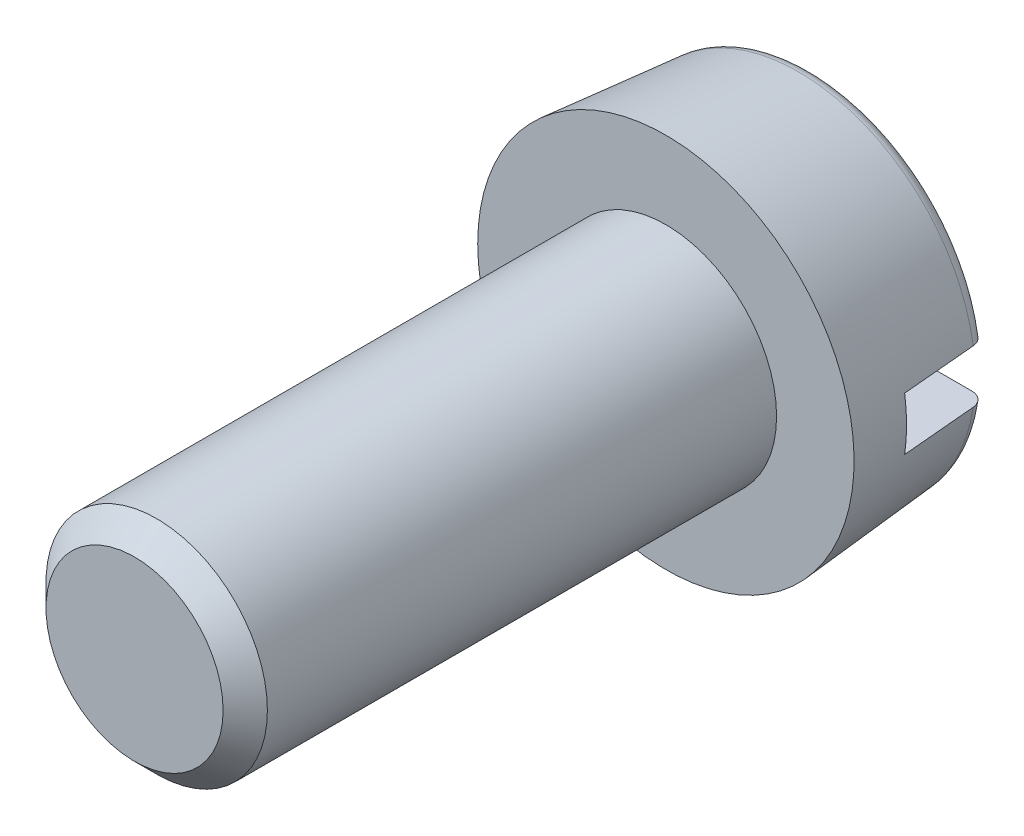
ISO-10303-21;
HEADER;
FILE_DESCRIPTION(('STEP AP214'),'2;1');
FILE_NAME('part.step','',(''),(''),'','','');
FILE_SCHEMA(('AUTOMOTIVE_DESIGN { 1 0 10303 214 1 1 1 1 }'));
ENDSEC;
DATA;
#1=APPLICATION_CONTEXT('core data for automotive mechanical design processes');
#2=APPLICATION_PROTOCOL_DEFINITION('international standard','automotive_design',2000,#1);
#3=PRODUCT_CONTEXT('',#1,'mechanical');
#4=PRODUCT('Part','Part','',(#3));
#5=PRODUCT_RELATED_PRODUCT_CATEGORY('part','',(#4));
#6=PRODUCT_DEFINITION_FORMATION('','',#4);
#7=PRODUCT_DEFINITION_CONTEXT('part definition',#1,'design');
#8=PRODUCT_DEFINITION('design','',#6,#7);
#9=PRODUCT_DEFINITION_SHAPE('','',#8);
#10=(LENGTH_UNIT() NAMED_UNIT(*) SI_UNIT(.MILLI.,.METRE.));
#11=(NAMED_UNIT(*) PLANE_ANGLE_UNIT() SI_UNIT($,.RADIAN.));
#12=(NAMED_UNIT(*) SI_UNIT($,.STERADIAN.) SOLID_ANGLE_UNIT());
#13=UNCERTAINTY_MEASURE_WITH_UNIT(LENGTH_MEASURE(1.E-05),#10,'distance_accuracy_value','');
#14=(GEOMETRIC_REPRESENTATION_CONTEXT(3) GLOBAL_UNCERTAINTY_ASSIGNED_CONTEXT((#13)) GLOBAL_UNIT_ASSIGNED_CONTEXT((#10,
#11,#12)) REPRESENTATION_CONTEXT('',''));
#15=CARTESIAN_POINT('',(0.,0.,0.));
#16=DIRECTION('',(0.,0.,1.));
#17=DIRECTION('',(1.,0.,0.));
#18=AXIS2_PLACEMENT_3D('',#15,#16,#17);
#19=CARTESIAN_POINT('',(0.,0.,-3.3));
#20=DIRECTION('',(0.,0.,1.));
#21=DIRECTION('',(1.,0.,0.));
#22=AXIS2_PLACEMENT_3D('',#19,#20,#21);
#23=PLANE('',#22);
#24=DIRECTION('',(1.,0.,0.));
#25=VECTOR('',#24,1.);
#26=CARTESIAN_POINT('',(-4.25,-0.6,-3.3));
#27=LINE('',#26,#25);
#28=CARTESIAN_POINT('',(-3.60936773882135,-0.6,-3.3));
#29=VERTEX_POINT('',#28);
#30=CARTESIAN_POINT('',(3.60936773882135,-0.6,-3.3));
#31=VERTEX_POINT('',#30);
#32=EDGE_CURVE('E190',#29,#31,#27,.T.);
#33=ORIENTED_EDGE('',*,*,#32,.T.);
#34=CARTESIAN_POINT('',(0.,0.,-3.3));
#35=DIRECTION('',(0.,0.,-1.));
#36=DIRECTION('',(-1.,0.,0.));
#37=AXIS2_PLACEMENT_3D('',#34,#35,#36);
#38=CIRCLE('',#37,3.6588981229387);
#39=EDGE_CURVE('E116',#31,#29,#38,.T.);
#40=ORIENTED_EDGE('',*,*,#39,.T.);
#41=EDGE_LOOP('',(#33,#40));
#42=FACE_BOUND('',#41,.T.);
#43=ADVANCED_FACE('F36',(#42),#23,.F.);
#44=DIRECTION('',(-1.,0.,0.));
#45=VECTOR('',#44,1.);
#46=CARTESIAN_POINT('',(-4.25,0.6,-3.3));
#47=LINE('',#46,#45);
#48=CARTESIAN_POINT('',(3.60936773882135,0.6,-3.3));
#49=VERTEX_POINT('',#48);
#50=CARTESIAN_POINT('',(-3.60936773882135,0.6,-3.3));
#51=VERTEX_POINT('',#50);
#52=EDGE_CURVE('E101',#49,#51,#47,.T.);
#53=ORIENTED_EDGE('',*,*,#52,.T.);
#54=EDGE_CURVE('E113',#51,#49,#38,.T.);
#55=ORIENTED_EDGE('',*,*,#54,.T.);
#56=EDGE_LOOP('',(#53,#55));
#57=FACE_BOUND('',#56,.T.);
#58=ADVANCED_FACE('F184',(#57),#23,.F.);
#59=CARTESIAN_POINT('',(0.,0.,-2.97));
#60=DIRECTION('',(0.,0.,-1.));
#61=DIRECTION('',(-1.,0.,0.));
#62=AXIS2_PLACEMENT_3D('',#59,#60,#61);
#63=TOROIDAL_SURFACE('',#62,3.6588981229387,0.330000000000001);
#64=CARTESIAN_POINT('',(-3.88093121590333,-0.6,-3.16235651870229));
#65=CARTESIAN_POINT('',(-3.89174650430115,-0.6,-3.14745596543585));
#66=CARTESIAN_POINT('',(-3.90131895220058,-0.6,-3.13163782999302));
#67=CARTESIAN_POINT('',(-3.91768386388027,-0.6,-3.09860811426153));
#68=CARTESIAN_POINT('',(-3.92447332099475,-0.6,-3.08139505084313));
#69=CARTESIAN_POINT('',(-3.93505791012376,-0.6,-3.04607287048011));
#70=CARTESIAN_POINT('',(-3.93885357012141,-0.6,-3.02796391213358));
#71=CARTESIAN_POINT('',(-3.94333535109313,-0.6,-2.99136961244277));
#72=CARTESIAN_POINT('',(-3.94402220053428,-0.6,-2.97288436029284));
#73=CARTESIAN_POINT('',(-3.94227140944713,-0.6,-2.9361368868103));
#74=CARTESIAN_POINT('',(-3.93984626629599,-0.6,-2.91787406886792));
#75=CARTESIAN_POINT('',(-3.93196602602826,-0.6,-2.88201412670734));
#76=CARTESIAN_POINT('',(-3.92651084758586,-0.6,-2.86441702037031));
#77=CARTESIAN_POINT('',(-3.91272898214808,-0.6,-2.83037210992902));
#78=CARTESIAN_POINT('',(-3.90440030256529,-0.6,-2.81392511289455));
#79=CARTESIAN_POINT('',(-3.88511861466897,-0.6,-2.78264968687381));
#80=CARTESIAN_POINT('',(-3.87416553729813,-0.6,-2.76782130049394));
#81=CARTESIAN_POINT('',(-3.84986660189993,-0.6,-2.74008712510161));
#82=CARTESIAN_POINT('',(-3.83650421986518,-0.6,-2.7271958174107));
#83=CARTESIAN_POINT('',(-3.80782590033311,-0.6,-2.70380952789554));
#84=CARTESIAN_POINT('',(-3.79250985946234,-0.6,-2.69331467295624));
#85=CARTESIAN_POINT('',(-3.76017561287824,-0.6,-2.67489241251668));
#86=CARTESIAN_POINT('',(-3.74314020192673,-0.6,-2.66699520734851));
#87=CARTESIAN_POINT('',(-3.70799548005462,-0.6,-2.65413616350433));
#88=CARTESIAN_POINT('',(-3.68988609932778,-0.6,-2.64917451586521));
#89=CARTESIAN_POINT('',(-3.65288598819943,-0.6,-2.64227180541858));
#90=CARTESIAN_POINT('',(-3.63398869431002,-0.6,-2.64036590382202));
#91=CARTESIAN_POINT('',(-3.59614043659641,-0.6,-2.63972980755772));
#92=CARTESIAN_POINT('',(-3.57718947014834,-0.6,-2.64099977092163));
#93=CARTESIAN_POINT('',(-3.53963364564484,-0.6,-2.64669886697945));
#94=CARTESIAN_POINT('',(-3.52103209259875,-0.6,-2.65114981293852));
#95=CARTESIAN_POINT('',(-3.48484117066273,-0.6,-2.66311534646283));
#96=CARTESIAN_POINT('',(-3.46725181166065,-0.6,-2.67062996395041));
#97=CARTESIAN_POINT('',(-3.43361753268664,-0.6,-2.68850884662317));
#98=CARTESIAN_POINT('',(-3.41757045287305,-0.6,-2.69886904591932));
#99=CARTESIAN_POINT('',(-3.38746679497394,-0.6,-2.72216302425203));
#100=CARTESIAN_POINT('',(-3.37341012214719,-0.6,-2.73509668072428));
#101=CARTESIAN_POINT('',(-3.34784979568404,-0.6,-2.76303096104915));
#102=CARTESIAN_POINT('',(-3.33632096945094,-0.6,-2.77800854314369));
#103=CARTESIAN_POINT('',(-3.31598781177585,-0.6,-2.80971149494498));
#104=CARTESIAN_POINT('',(-3.30718323692532,-0.6,-2.82643670832428));
#105=CARTESIAN_POINT('',(-3.29269082949409,-0.6,-2.86088519965016));
#106=CARTESIAN_POINT('',(-3.28695731461753,-0.6,-2.87858926166235));
#107=CARTESIAN_POINT('',(-3.27858571186085,-0.6,-2.91471449521117));
#108=CARTESIAN_POINT('',(-3.27594737138457,-0.6,-2.93313560810272));
#109=CARTESIAN_POINT('',(-3.27386359733721,-0.6,-2.96992922570346));
#110=CARTESIAN_POINT('',(-3.27437926370451,-0.6,-2.9882995379395));
#111=CARTESIAN_POINT('',(-3.27849603145179,-0.6,-3.02469054646185));
#112=CARTESIAN_POINT('',(-3.28209704814968,-0.6,-3.04271125232974));
#113=CARTESIAN_POINT('',(-3.29225896258976,-0.6,-3.0778495063858));
#114=CARTESIAN_POINT('',(-3.2988126837202,-0.6,-3.09496913265389));
#115=CARTESIAN_POINT('',(-3.31467711351297,-0.6,-3.12787861026696));
#116=CARTESIAN_POINT('',(-3.3239879156334,-0.6,-3.14366841651109));
#117=CARTESIAN_POINT('',(-3.34518159696389,-0.6,-3.17362232169774));
#118=CARTESIAN_POINT('',(-3.35708617614416,-0.6,-3.18777106006248));
#119=CARTESIAN_POINT('',(-3.38307011718918,-0.6,-3.21390575440203));
#120=CARTESIAN_POINT('',(-3.397149644745,-0.6,-3.22589154544908));
#121=CARTESIAN_POINT('',(-3.42730774319539,-0.6,-3.24754984447172));
#122=CARTESIAN_POINT('',(-3.44341295154226,-0.6,-3.25718526159405));
#123=CARTESIAN_POINT('',(-3.47699616958134,-0.6,-3.27365724363798));
#124=CARTESIAN_POINT('',(-3.49447428649553,-0.6,-3.28049358969709));
#125=CARTESIAN_POINT('',(-3.530559611778,-0.6,-3.29126249574783));
#126=CARTESIAN_POINT('',(-3.54917882328667,-0.6,-3.29515486284366));
#127=CARTESIAN_POINT('',(-3.58680532705641,-0.6,-3.29977905483034));
#128=CARTESIAN_POINT('',(-3.60581262161511,-0.6,-3.30051086100379));
#129=CARTESIAN_POINT('',(-3.64379387652628,-0.6,-3.29878612292724));
#130=CARTESIAN_POINT('',(-3.6627669953293,-0.6,-3.29631095100565));
#131=CARTESIAN_POINT('',(-3.70003092134979,-0.6,-3.2881993045486));
#132=CARTESIAN_POINT('',(-3.71832156288977,-0.6,-3.28256206765038));
#133=CARTESIAN_POINT('',(-3.75363601699996,-0.6,-3.26829463409941));
#134=CARTESIAN_POINT('',(-3.77066317119872,-0.6,-3.25967270079204));
#135=CARTESIAN_POINT('',(-3.80299261306495,-0.6,-3.23966998581314));
#136=CARTESIAN_POINT('',(-3.81829702760437,-0.6,-3.22829266186643));
#137=CARTESIAN_POINT('',(-3.84151948900552,-0.6,-3.20772421469506));
#138=CARTESIAN_POINT('',(-3.85009030219367,-0.6,-3.19925784921992));
#139=CARTESIAN_POINT('',(-3.86626148045935,-0.6,-3.18144383819673));
#140=CARTESIAN_POINT('',(-3.87386185148573,-0.6,-3.17209619805154));
#141=CARTESIAN_POINT('',(-3.88093121590333,-0.6,-3.16235651870229));
#142=B_SPLINE_CURVE_WITH_KNOTS('',3,(#64,#65,#66,#67,#68,#69,#70,#71,#72,#73,#74,#75,#76,#77,
#78,#79,#80,#81,#82,#83,#84,#85,#86,#87,#88,#89,#90,#91,#92,#93,#94,#95,#96,#97,#98,#99,#100,
#101,#102,#103,#104,#105,#106,#107,#108,#109,#110,#111,#112,#113,#114,#115,#116,#117,#118,#119,
#120,#121,#122,#123,#124,#125,#126,#127,#128,#129,#130,#131,#132,#133,#134,#135,#136,#137,#138,
#139,#140,#141),.UNSPECIFIED.,.T.,.F.,(4,2,2,2,2,2,2,2,2,2,2,2,2,2,2,2,2,2,2,2,2,2,2,2,2,2,2,2,
2,2,2,2,2,2,2,2,2,2,4),(0.,0.055192137510341,0.110443746898564,0.165685609987464,
0.220914527944668,0.275922345952343,0.330931640434962,0.38597915723318,0.441028122687705,
0.496470086974644,0.551914986065863,0.607983408306651,0.664055478903414,0.720768233421821,
0.777483810033931,0.834592086400185,0.891700920546502,0.948728575871203,1.00575351582767,
1.06218182397462,1.11860508886393,1.17416394419936,1.22971826507945,1.28458879784994,
1.3394578246644,1.39419420461358,1.44893244020039,1.50414752609964,1.55936682044904,
1.61540809585674,1.67145375235813,1.72825141241312,1.78504940883299,1.84217879901403,
1.89932196881453,1.95630818246031,2.0132232516225,2.04929956420957,2.08537565563636),.UNSPECIFIED.);
#143=CARTESIAN_POINT('',(-3.94224449995299,-0.6,-2.99876139510674));
#144=VERTEX_POINT('',#143);
#145=EDGE_CURVE('E58',#29,#144,#142,.T.);
#146=ORIENTED_EDGE('',*,*,#145,.F.);
#147=ORIENTED_EDGE('',*,*,#39,.F.);
#148=CARTESIAN_POINT('',(3.29440264116713,-0.6,-3.08230315486664));
#149=CARTESIAN_POINT('',(3.28809785682509,-0.6,-3.0651620918642));
#150=CARTESIAN_POINT('',(3.28322982249747,-0.6,-3.04747923181528));
#151=CARTESIAN_POINT('',(3.27652850861774,-0.6,-3.01153352646089));
#152=CARTESIAN_POINT('',(3.27469849047988,-0.6,-2.99327007927587));
#153=CARTESIAN_POINT('',(3.27413756897987,-0.6,-2.95670045280513));
#154=CARTESIAN_POINT('',(3.27540558007777,-0.6,-2.93839429073216));
#155=CARTESIAN_POINT('',(3.28099874541124,-0.6,-2.90226005994108));
#156=CARTESIAN_POINT('',(3.28532324094341,-0.6,-2.88443188907011));
#157=CARTESIAN_POINT('',(3.29689219553413,-0.6,-2.84975492468261));
#158=CARTESIAN_POINT('',(3.30413599281067,-0.6,-2.8329059101891));
#159=CARTESIAN_POINT('',(3.3213231213081,-0.6,-2.80064624787541));
#160=CARTESIAN_POINT('',(3.33126664812177,-0.6,-2.7852357043798));
#161=CARTESIAN_POINT('',(3.35366868808773,-0.6,-2.75612471593795));
#162=CARTESIAN_POINT('',(3.3661508913195,-0.6,-2.74244250841607));
#163=CARTESIAN_POINT('',(3.3932045000746,-0.6,-2.71732930698502));
#164=CARTESIAN_POINT('',(3.40777606367686,-0.6,-2.7058984835688));
#165=CARTESIAN_POINT('',(3.4388307483732,-0.6,-2.6854297211878));
#166=CARTESIAN_POINT('',(3.45533944088639,-0.6,-2.67643057577337));
#167=CARTESIAN_POINT('',(3.48961941011365,-0.6,-2.66129114238248));
#168=CARTESIAN_POINT('',(3.50739077810089,-0.6,-2.65515106131782));
#169=CARTESIAN_POINT('',(3.54393539998491,-0.6,-2.64582999278256));
#170=CARTESIAN_POINT('',(3.56271853642499,-0.6,-2.64268771745918));
#171=CARTESIAN_POINT('',(3.60054621208149,-0.6,-2.63958409837503));
#172=CARTESIAN_POINT('',(3.61959076161942,-0.6,-2.63962288057692));
#173=CARTESIAN_POINT('',(3.65749738812001,-0.6,-2.64289265374059));
#174=CARTESIAN_POINT('',(3.6763581390613,-0.6,-2.64613906556673));
#175=CARTESIAN_POINT('',(3.71326281795159,-0.6,-2.65576554493082));
#176=CARTESIAN_POINT('',(3.73130675511293,-0.6,-2.66214557711697));
#177=CARTESIAN_POINT('',(3.76597993786739,-0.6,-2.67783761718015));
#178=CARTESIAN_POINT('',(3.78261484226845,-0.6,-2.68713711450786));
#179=CARTESIAN_POINT('',(3.81406528030207,-0.6,-2.70842491997945));
#180=CARTESIAN_POINT('',(3.82888090706133,-0.6,-2.72041309040444));
#181=CARTESIAN_POINT('',(3.85610446338851,-0.6,-2.74660594588476));
#182=CARTESIAN_POINT('',(3.8685359407796,-0.6,-2.76078615300224));
#183=CARTESIAN_POINT('',(3.89080726868229,-0.6,-2.79105382298191));
#184=CARTESIAN_POINT('',(3.90064729259725,-0.6,-2.80714115812689));
#185=CARTESIAN_POINT('',(3.91733416350674,-0.6,-2.8405601028488));
#186=CARTESIAN_POINT('',(3.92421525385964,-0.6,-2.85787461681646));
#187=CARTESIAN_POINT('',(3.93494358812121,-0.6,-2.89341927857302));
#188=CARTESIAN_POINT('',(3.93879100056809,-0.6,-2.91164937543618));
#189=CARTESIAN_POINT('',(3.94331406953077,-0.6,-2.94833527146554));
#190=CARTESIAN_POINT('',(3.94401737622784,-0.6,-2.9667876662529));
#191=CARTESIAN_POINT('',(3.94230652264016,-0.6,-3.00354703268234));
#192=CARTESIAN_POINT('',(3.9398924431818,-0.6,-3.02185400808242));
#193=CARTESIAN_POINT('',(3.93203104319353,-0.6,-3.05775084711038));
#194=CARTESIAN_POINT('',(3.92659214557767,-0.6,-3.07534255713777));
#195=CARTESIAN_POINT('',(3.91284977874762,-0.6,-3.10936852204448));
#196=CARTESIAN_POINT('',(3.90454627778583,-0.6,-3.12580276409349));
#197=CARTESIAN_POINT('',(3.88528034162925,-0.6,-3.15712284793096));
#198=CARTESIAN_POINT('',(3.87430720464612,-0.6,-3.17200210415539));
#199=CARTESIAN_POINT('',(3.8500405242241,-0.6,-3.19972912529818));
#200=CARTESIAN_POINT('',(3.83674688385466,-0.6,-3.21257680531212));
#201=CARTESIAN_POINT('',(3.80808268454837,-0.6,-3.2360101962057));
#202=CARTESIAN_POINT('',(3.79269344022077,-0.6,-3.24657304653352));
#203=CARTESIAN_POINT('',(3.76037673698728,-0.6,-3.26500063670313));
#204=CARTESIAN_POINT('',(3.74344917997591,-0.6,-3.27286520430968));
#205=CARTESIAN_POINT('',(3.70832088101352,-0.6,-3.28577099453551));
#206=CARTESIAN_POINT('',(3.69010738623741,-0.6,-3.29077750898379));
#207=CARTESIAN_POINT('',(3.6531016000557,-0.6,-3.29769462174044));
#208=CARTESIAN_POINT('',(3.63430927286435,-0.6,-3.2996050282419));
#209=CARTESIAN_POINT('',(3.5964831986523,-0.6,-3.30028781473323));
#210=CARTESIAN_POINT('',(3.57744888872153,-0.6,-3.29902930399356));
#211=CARTESIAN_POINT('',(3.53985927541686,-0.6,-3.29334556711437));
#212=CARTESIAN_POINT('',(3.52130396970548,-0.6,-3.28892035643095));
#213=CARTESIAN_POINT('',(3.48514277386075,-0.6,-3.27700380858252));
#214=CARTESIAN_POINT('',(3.46753990766998,-0.6,-3.2695032879444));
#215=CARTESIAN_POINT('',(3.43384889483254,-0.6,-3.2516337097796));
#216=CARTESIAN_POINT('',(3.4177610975725,-0.6,-3.24126399275462));
#217=CARTESIAN_POINT('',(3.38766821281395,-0.6,-3.21800708615103));
#218=CARTESIAN_POINT('',(3.37365189483885,-0.6,-3.20513441907141));
#219=CARTESIAN_POINT('',(3.34803025055685,-0.6,-3.17719862775502));
#220=CARTESIAN_POINT('',(3.33642183903014,-0.6,-3.16213834909857));
#221=CARTESIAN_POINT('',(3.31975710330549,-0.6,-3.13617199806855));
#222=CARTESIAN_POINT('',(3.31386604176812,-0.6,-3.125791798727));
#223=CARTESIAN_POINT('',(3.30324676962177,-0.6,-3.10445241547406));
#224=CARTESIAN_POINT('',(3.29851854980378,-0.6,-3.09349323614869));
#225=CARTESIAN_POINT('',(3.29440264116713,-0.6,-3.08230315486664));
#226=B_SPLINE_CURVE_WITH_KNOTS('',3,(#148,#149,#150,#151,#152,#153,#154,#155,#156,#157,#158,
#159,#160,#161,#162,#163,#164,#165,#166,#167,#168,#169,#170,#171,#172,#173,#174,#175,#176,#177,
#178,#179,#180,#181,#182,#183,#184,#185,#186,#187,#188,#189,#190,#191,#192,#193,#194,#195,#196,
#197,#198,#199,#200,#201,#202,#203,#204,#205,#206,#207,#208,#209,#210,#211,#212,#213,#214,#215,
#216,#217,#218,#219,#220,#221,#222,#223,#224,#225),.UNSPECIFIED.,.T.,.F.,(4,2,2,2,2,2,2,2,2,2,2,
2,2,2,2,2,2,2,2,2,2,2,2,2,2,2,2,2,2,2,2,2,2,2,2,2,2,2,4),(0.,0.0547481625662647,
0.109555061239329,0.164342758497483,0.21911865205018,0.273882135331299,0.32864958723287,
0.383953717429165,0.439262034091064,0.495406610210971,0.551555248908528,0.608419522463505,
0.665286047715751,0.722427298874321,0.779567905411152,0.836466919420668,0.893363019621015,
0.949664412087646,1.00596203627061,1.06158935144854,1.11721357599228,1.17234765017797,
1.22748029489729,1.28246018032845,1.33744067510554,1.39264531122165,1.44785225386195,
1.50358833815955,1.55932797950943,1.61573086082995,1.67213723623064,1.72909558755459,
1.78605366087693,1.84318307540712,1.90032563232671,1.9571460332605,2.01389317499336,
2.04963432132589,2.08537518460094),.UNSPECIFIED.);
#227=CARTESIAN_POINT('',(3.94224449995295,-0.6,-2.99876139510673));
#228=VERTEX_POINT('',#227);
#229=EDGE_CURVE('E135',#228,#31,#226,.T.);
#230=ORIENTED_EDGE('',*,*,#229,.F.);
#231=CARTESIAN_POINT('',(0.,0.,-2.99876139510673));
#232=DIRECTION('',(0.,0.,-1.));
#233=DIRECTION('',(-1.,0.,0.));
#234=AXIS2_PLACEMENT_3D('',#231,#232,#233);
#235=CIRCLE('',#234,3.98764237330898);
#236=EDGE_CURVE('E125',#228,#144,#235,.T.);
#237=ORIENTED_EDGE('',*,*,#236,.T.);
#238=EDGE_LOOP('',(#146,#147,#230,#237));
#239=FACE_BOUND('',#238,.T.);
#240=ADVANCED_FACE('F140',(#239),#63,.T.);
#241=CARTESIAN_POINT('',(-3.88093121590333,0.6,-3.16235651870229));
#242=CARTESIAN_POINT('',(-3.86994562426118,0.6,-3.17748883766612));
#243=CARTESIAN_POINT('',(-3.8576617997997,0.6,-3.19169676662875));
#244=CARTESIAN_POINT('',(-3.83086570493505,0.6,-3.21785274484901));
#245=CARTESIAN_POINT('',(-3.81635047209743,0.6,-3.2297977420582));
#246=CARTESIAN_POINT('',(-3.78553913677772,0.6,-3.25107812608493));
#247=CARTESIAN_POINT('',(-3.76924481278604,0.6,-3.26041608642867));
#248=CARTESIAN_POINT('',(-3.73533536566413,0.6,-3.27624833155541));
#249=CARTESIAN_POINT('',(-3.71772056932636,0.6,-3.28274331721858));
#250=CARTESIAN_POINT('',(-3.68149968606228,0.6,-3.29277255152332));
#251=CARTESIAN_POINT('',(-3.66288621895556,0.6,-3.29628014823096));
#252=CARTESIAN_POINT('',(-3.62533412107233,0.6,-3.3001499555616));
#253=CARTESIAN_POINT('',(-3.60639545866776,0.6,-3.30051185848257));
#254=CARTESIAN_POINT('',(-3.56856016731013,0.6,-3.29807389596846));
#255=CARTESIAN_POINT('',(-3.54966526946925,0.6,-3.29524708144183));
#256=CARTESIAN_POINT('',(-3.51261639347629,0.6,-3.2864651654343));
#257=CARTESIAN_POINT('',(-3.49446243067796,0.6,-3.28050999916265));
#258=CARTESIAN_POINT('',(-3.45939741685541,0.6,-3.26562312733291));
#259=CARTESIAN_POINT('',(-3.44248757272263,0.6,-3.25668857682739));
#260=CARTESIAN_POINT('',(-3.41042432643625,0.6,-3.23608480203363));
#261=CARTESIAN_POINT('',(-3.39527086309853,0.6,-3.22441567304814));
#262=CARTESIAN_POINT('',(-3.36729252044249,0.6,-3.19877091701603));
#263=CARTESIAN_POINT('',(-3.35444928577192,0.6,-3.18481532452711));
#264=CARTESIAN_POINT('',(-3.33133020423408,0.6,-3.15491819874357));
#265=CARTESIAN_POINT('',(-3.32105414881803,0.6,-3.13897682692456));
#266=CARTESIAN_POINT('',(-3.30352389705047,0.6,-3.10581171190925));
#267=CARTESIAN_POINT('',(-3.29622739898836,0.6,-3.08861032935923));
#268=CARTESIAN_POINT('',(-3.28467217635103,0.6,-3.05321591460979));
#269=CARTESIAN_POINT('',(-3.28041318040293,0.6,-3.03502297115358));
#270=CARTESIAN_POINT('',(-3.27510706553712,0.6,-2.99843307350807));
#271=CARTESIAN_POINT('',(-3.2740161945363,0.6,-2.9800424540463));
#272=CARTESIAN_POINT('',(-3.27495596854452,0.6,-2.9433416530812));
#273=CARTESIAN_POINT('',(-3.27698647627844,0.6,-2.92503146807596));
#274=CARTESIAN_POINT('',(-3.28408517105067,0.6,-2.88911263597449));
#275=CARTESIAN_POINT('',(-3.28913704602762,0.6,-2.8715007593439));
#276=CARTESIAN_POINT('',(-3.30210833607114,0.6,-2.83736742562521));
#277=CARTESIAN_POINT('',(-3.31002780849528,0.6,-2.8208459903559));
#278=CARTESIAN_POINT('',(-3.32855183486609,0.6,-2.78924869421971));
#279=CARTESIAN_POINT('',(-3.33917251924599,0.6,-2.77418229547369));
#280=CARTESIAN_POINT('',(-3.36276008760585,0.6,-2.74601486996886));
#281=CARTESIAN_POINT('',(-3.37572713028083,0.6,-2.73291397625589));
#282=CARTESIAN_POINT('',(-3.40383191812352,0.6,-2.70885221982195));
#283=CARTESIAN_POINT('',(-3.41899752420356,0.6,-2.69792390281018));
#284=CARTESIAN_POINT('',(-3.45092687836566,0.6,-2.67872542890273));
#285=CARTESIAN_POINT('',(-3.46769075329965,0.6,-2.67045548322565));
#286=CARTESIAN_POINT('',(-3.50260223363685,0.6,-2.65668752672315));
#287=CARTESIAN_POINT('',(-3.52076636456159,0.6,-2.65123140086425));
#288=CARTESIAN_POINT('',(-3.55774960801579,0.6,-2.64341800700996));
#289=CARTESIAN_POINT('',(-3.57656875672722,0.6,-2.64106091047896));
#290=CARTESIAN_POINT('',(-3.61449273570096,0.6,-2.63950384272766));
#291=CARTESIAN_POINT('',(-3.63359864301166,0.6,-2.64032993792948));
#292=CARTESIAN_POINT('',(-3.67140054176702,0.6,-2.64518065992189));
#293=CARTESIAN_POINT('',(-3.69009653042407,0.6,-2.64920530845692));
#294=CARTESIAN_POINT('',(-3.72652506275735,0.6,-2.66034506551649));
#295=CARTESIAN_POINT('',(-3.74425851755716,0.6,-2.66745719197708));
#296=CARTESIAN_POINT('',(-3.77826491940497,0.6,-2.68458287381672));
#297=CARTESIAN_POINT('',(-3.7945379197202,0.6,-2.69459632331932));
#298=CARTESIAN_POINT('',(-3.82500810594656,0.6,-2.7171524340482));
#299=CARTESIAN_POINT('',(-3.83922196548349,0.6,-2.72967256558659));
#300=CARTESIAN_POINT('',(-3.86531446531521,0.6,-2.75694736066752));
#301=CARTESIAN_POINT('',(-3.87719325142421,0.6,-2.77170188458097));
#302=CARTESIAN_POINT('',(-3.89812780235084,0.6,-2.80283774858194));
#303=CARTESIAN_POINT('',(-3.90721554334421,0.6,-2.81919759002697));
#304=CARTESIAN_POINT('',(-3.922481581142,0.6,-2.85322194597623));
#305=CARTESIAN_POINT('',(-3.92866017698297,0.6,-2.87088632616841));
#306=CARTESIAN_POINT('',(-3.93786994983662,0.6,-2.9068184073232));
#307=CARTESIAN_POINT('',(-3.940933607169,0.6,-2.92507778921154));
#308=CARTESIAN_POINT('',(-3.9439344449815,0.6,-2.96185658811031));
#309=CARTESIAN_POINT('',(-3.94387094913863,0.6,-2.98037606050582));
#310=CARTESIAN_POINT('',(-3.94062675954038,0.6,-3.01704828879195));
#311=CARTESIAN_POINT('',(-3.93746096481408,0.6,-3.03520237428727));
#312=CARTESIAN_POINT('',(-3.92813087004799,0.6,-3.07070616149259));
#313=CARTESIAN_POINT('',(-3.92197027086237,0.6,-3.0880568271264));
#314=CARTESIAN_POINT('',(-3.90982474787756,0.6,-3.1148958546973));
#315=CARTESIAN_POINT('',(-3.90472284548654,0.6,-3.12479361156266));
#316=CARTESIAN_POINT('',(-3.89354422688732,0.6,-3.14402216464536));
#317=CARTESIAN_POINT('',(-3.88746751590026,0.6,-3.153352963899));
#318=CARTESIAN_POINT('',(-3.88093121590333,0.6,-3.16235651870229));
#319=B_SPLINE_CURVE_WITH_KNOTS('',3,(#241,#242,#243,#244,#245,#246,#247,#248,#249,#250,#251,
#252,#253,#254,#255,#256,#257,#258,#259,#260,#261,#262,#263,#264,#265,#266,#267,#268,#269,#270,
#271,#272,#273,#274,#275,#276,#277,#278,#279,#280,#281,#282,#283,#284,#285,#286,#287,#288,#289,
#290,#291,#292,#293,#294,#295,#296,#297,#298,#299,#300,#301,#302,#303,#304,#305,#306,#307,#308,
#309,#310,#311,#312,#313,#314,#315,#316,#317,#318),.UNSPECIFIED.,.T.,.F.,(4,2,2,2,2,2,2,2,2,2,2,
2,2,2,2,2,2,2,2,2,2,2,2,2,2,2,2,2,2,2,2,2,2,2,2,2,2,2,4),(0.,0.0560572022225451,
0.112189479573424,0.168266148651357,0.224328985319248,0.280886897287983,0.337450341514255,
0.394495430505763,0.451541700994681,0.508642600421072,0.565741510120691,0.622364518306558,
0.678982925138324,0.734766939871623,0.790545970191799,0.845550936423328,0.900553483660387,
0.955261724861557,1.00997106039525,1.06501509770297,1.12006285928468,1.17588167379849,
1.23170492225272,1.28833673949869,1.3449716899617,1.40207139265232,1.45917148352222,
1.51621654611497,1.57325952725464,1.6298111390954,1.68635921843495,1.74223294240041,
1.79810092174535,1.85338018377155,1.9086714013361,1.96369837348059,2.01865751779187,
2.05201108354366,2.08536447065746),.UNSPECIFIED.);
#320=CARTESIAN_POINT('',(-3.94224449995295,0.6,-2.99876139510673));
#321=VERTEX_POINT('',#320);
#322=EDGE_CURVE('E196',#321,#51,#319,.T.);
#323=ORIENTED_EDGE('',*,*,#322,.F.);
#324=CARTESIAN_POINT('',(3.94224449995299,0.6,-2.99876139510674));
#325=VERTEX_POINT('',#324);
#326=EDGE_CURVE('E121',#321,#325,#235,.T.);
#327=ORIENTED_EDGE('',*,*,#326,.T.);
#328=CARTESIAN_POINT('',(3.29440264116713,0.6,-3.08230315486664));
#329=CARTESIAN_POINT('',(3.30080765609273,0.6,-3.09971174526295));
#330=CARTESIAN_POINT('',(3.30870432092561,0.6,-3.11658702973489));
#331=CARTESIAN_POINT('',(3.32723725523488,0.6,-3.14877873342185));
#332=CARTESIAN_POINT('',(3.33787720288346,0.6,-3.16409302089727));
#333=CARTESIAN_POINT('',(3.36155741665624,0.6,-3.19270893733703));
#334=CARTESIAN_POINT('',(3.37459497867817,0.6,-3.20601280322632));
#335=CARTESIAN_POINT('',(3.40269212857552,0.6,-3.23026849641935));
#336=CARTESIAN_POINT('',(3.4177512390003,0.6,-3.24122087751547));
#337=CARTESIAN_POINT('',(3.44964717569566,0.6,-3.26060347183518));
#338=CARTESIAN_POINT('',(3.46650214940284,0.6,-3.26900382045027));
#339=CARTESIAN_POINT('',(3.50137211154229,0.6,-3.28289497224797));
#340=CARTESIAN_POINT('',(3.5193872279058,0.6,-3.28838545393551));
#341=CARTESIAN_POINT('',(3.55629957107124,0.6,-3.29636116668582));
#342=CARTESIAN_POINT('',(3.57520482744366,0.6,-3.29880927515191));
#343=CARTESIAN_POINT('',(3.6131589644941,0.6,-3.30051042552821));
#344=CARTESIAN_POINT('',(3.63220784982208,0.6,-3.29976336354837));
#345=CARTESIAN_POINT('',(3.66998396624487,0.6,-3.29508032255844));
#346=CARTESIAN_POINT('',(3.68870969823022,0.6,-3.29113222445873));
#347=CARTESIAN_POINT('',(3.72522679379517,0.6,-3.28013231314993));
#348=CARTESIAN_POINT('',(3.74301817470936,0.6,-3.27308055754432));
#349=CARTESIAN_POINT('',(3.77706024294323,0.6,-3.25610444988627));
#350=CARTESIAN_POINT('',(3.79331833877131,0.6,-3.24619496122916));
#351=CARTESIAN_POINT('',(3.82391612624977,0.6,-3.22375887023842));
#352=CARTESIAN_POINT('',(3.83825591986434,0.6,-3.21123240709649));
#353=CARTESIAN_POINT('',(3.86444180563886,0.6,-3.18406202206558));
#354=CARTESIAN_POINT('',(3.87631328893368,0.6,-3.16944257398407));
#355=CARTESIAN_POINT('',(3.89739845994427,0.6,-3.13839826667238));
#356=CARTESIAN_POINT('',(3.90661232657159,0.6,-3.12197352907769));
#357=CARTESIAN_POINT('',(3.92200844552748,0.6,-3.08799315082452));
#358=CARTESIAN_POINT('',(3.92822509589246,0.6,-3.07045309214261));
#359=CARTESIAN_POINT('',(3.93759777208076,0.6,-3.03457355338602));
#360=CARTESIAN_POINT('',(3.94075395969622,0.6,-3.01623411562429));
#361=CARTESIAN_POINT('',(3.94389612670329,0.6,-2.97943863736428));
#362=CARTESIAN_POINT('',(3.94390805322542,0.6,-2.96098480810599));
#363=CARTESIAN_POINT('',(3.94082654966627,0.6,-2.92433862598604));
#364=CARTESIAN_POINT('',(3.93773318767506,0.6,-2.90614626739995));
#365=CARTESIAN_POINT('',(3.92854399612151,0.6,-2.87057609626602));
#366=CARTESIAN_POINT('',(3.92245422480122,0.6,-2.85319671732771));
#367=CARTESIAN_POINT('',(3.90745683564995,0.6,-2.81970013095771));
#368=CARTESIAN_POINT('',(3.89854917649711,0.6,-2.80358294203926));
#369=CARTESIAN_POINT('',(3.87812899678641,0.6,-2.77298178563699));
#370=CARTESIAN_POINT('',(3.86660420887201,0.6,-2.75850600713961));
#371=CARTESIAN_POINT('',(3.84130994561887,0.6,-2.73167090613834));
#372=CARTESIAN_POINT('',(3.82754036790317,0.6,-2.7193116802157));
#373=CARTESIAN_POINT('',(3.79800175617084,0.6,-2.69692584023308));
#374=CARTESIAN_POINT('',(3.78221405781843,0.6,-2.68692385816356));
#375=CARTESIAN_POINT('',(3.74919897614646,0.6,-2.66967626685283));
#376=CARTESIAN_POINT('',(3.73197150178331,0.6,-2.66243083208175));
#377=CARTESIAN_POINT('',(3.69634648215191,0.6,-2.65081249330069));
#378=CARTESIAN_POINT('',(3.67793745398803,0.6,-2.64647479296253));
#379=CARTESIAN_POINT('',(3.64065434011927,0.6,-2.64092020476455));
#380=CARTESIAN_POINT('',(3.62178022768155,0.6,-2.63970349672231));
#381=CARTESIAN_POINT('',(3.58391704137421,0.6,-2.64042180801099));
#382=CARTESIAN_POINT('',(3.56492851642521,0.6,-2.64238604962319));
#383=CARTESIAN_POINT('',(3.5275479619155,0.6,-2.64946677571929));
#384=CARTESIAN_POINT('',(3.50915595059184,0.6,-2.65458335648333));
#385=CARTESIAN_POINT('',(3.47345279290325,0.6,-2.66784659796878));
#386=CARTESIAN_POINT('',(3.45614406674454,0.6,-2.67599977908623));
#387=CARTESIAN_POINT('',(3.42315400250106,0.6,-2.6951161855952));
#388=CARTESIAN_POINT('',(3.40747262673631,0.6,-2.70607934590352));
#389=CARTESIAN_POINT('',(3.3783088723949,0.6,-2.73042905696696));
#390=CARTESIAN_POINT('',(3.36481164623246,0.6,-2.74379781610121));
#391=CARTESIAN_POINT('',(3.34029306489808,0.6,-2.77263980450793));
#392=CARTESIAN_POINT('',(3.32927141954378,0.6,-2.78811278678608));
#393=CARTESIAN_POINT('',(3.31018691080946,0.6,-2.82048808763762));
#394=CARTESIAN_POINT('',(3.30208390831039,0.6,-2.83736674429639));
#395=CARTESIAN_POINT('',(3.28887246215325,0.6,-2.87226338585665));
#396=CARTESIAN_POINT('',(3.28376451420968,0.6,-2.89028155881421));
#397=CARTESIAN_POINT('',(3.27675958376417,0.6,-2.92666745503841));
#398=CARTESIAN_POINT('',(3.27481863650892,0.6,-2.945026749588));
#399=CARTESIAN_POINT('',(3.27407466644382,0.6,-2.98179276047186));
#400=CARTESIAN_POINT('',(3.27526757603414,0.6,-3.00019938438628));
#401=CARTESIAN_POINT('',(3.27964288068725,0.6,-3.02926106836674));
#402=CARTESIAN_POINT('',(3.28183959072452,0.6,-3.04007400144431));
#403=CARTESIAN_POINT('',(3.2873161233726,0.6,-3.06142179927136));
#404=CARTESIAN_POINT('',(3.29059593385473,0.6,-3.07195666713321));
#405=CARTESIAN_POINT('',(3.29440264116713,0.6,-3.08230315486664));
#406=B_SPLINE_CURVE_WITH_KNOTS('',3,(#328,#329,#330,#331,#332,#333,#334,#335,#336,#337,#338,
#339,#340,#341,#342,#343,#344,#345,#346,#347,#348,#349,#350,#351,#352,#353,#354,#355,#356,#357,
#358,#359,#360,#361,#362,#363,#364,#365,#366,#367,#368,#369,#370,#371,#372,#373,#374,#375,#376,
#377,#378,#379,#380,#381,#382,#383,#384,#385,#386,#387,#388,#389,#390,#391,#392,#393,#394,#395,
#396,#397,#398,#399,#400,#401,#402,#403,#404,#405),.UNSPECIFIED.,.T.,.F.,(4,2,2,2,2,2,2,2,2,2,2,
2,2,2,2,2,2,2,2,2,2,2,2,2,2,2,2,2,2,2,2,2,2,2,2,2,2,2,4),(0.,0.0556074472152162,
0.111289843740378,0.16690982088086,0.222516684694709,0.278751215430116,0.334991957912732,
0.391912410511319,0.448834713875816,0.505973536441003,0.563111298561735,0.619957081064999,
0.676799840822721,0.733025268241217,0.789246909663183,0.844806974970868,0.90036410292125,
0.955462746824388,1.0105601825986,1.06554667543618,1.12053397464009,1.1757845418527,
1.23103762955459,1.28684474608504,1.3426553942275,1.3991300888192,1.45560803715657,
1.51260777840758,1.56960926065609,1.62673385275082,1.6838571218763,1.74057408722779,
1.79728440086276,1.85318199012653,1.909088828447,1.96421274515775,2.01926514895936,
2.05231482156329,2.08536412408586),.UNSPECIFIED.);
#407=EDGE_CURVE('E197',#49,#325,#406,.T.);
#408=ORIENTED_EDGE('',*,*,#407,.F.);
#409=ORIENTED_EDGE('',*,*,#54,.F.);
#410=EDGE_LOOP('',(#323,#327,#408,#409));
#411=FACE_BOUND('',#410,.T.);
#412=ADVANCED_FACE('F168',(#411),#63,.T.);
#413=CARTESIAN_POINT('',(0.,0.,0.));
#414=DIRECTION('',(0.,0.,1.));
#415=DIRECTION('',(1.,0.,0.));
#416=AXIS2_PLACEMENT_3D('',#413,#414,#415);
#417=CONICAL_SURFACE('',#416,4.25,0.0872664625997166);
#418=CARTESIAN_POINT('',(0.,0.,0.));
#419=DIRECTION('',(0.,0.,-1.));
#420=DIRECTION('',(-1.,0.,0.));
#421=AXIS2_PLACEMENT_3D('',#418,#419,#420);
#422=CIRCLE('',#421,4.25);
#423=CARTESIAN_POINT('',(-4.25,0.,0.));
#424=VERTEX_POINT('',#423);
#425=EDGE_CURVE('E126',#424,#424,#422,.T.);
#426=ORIENTED_EDGE('',*,*,#425,.T.);
#427=EDGE_LOOP('',(#426));
#428=FACE_BOUND('',#427,.T.);
#429=CARTESIAN_POINT('',(-3.35207905905363,-0.6,-9.65435105732651));
#430=CARTESIAN_POINT('',(-3.53693192202119,-0.6,-7.57431453435525));
#431=CARTESIAN_POINT('',(-3.7213593617654,-0.6,-5.4942402850497));
#432=CARTESIAN_POINT('',(-3.94063586433137,-0.6,-3.01698288923857));
#433=CARTESIAN_POINT('',(-3.97577932862756,-0.6,-2.61982580831357));
#434=CARTESIAN_POINT('',(-4.23005524300636,-0.6,0.2546013917058));
#435=CARTESIAN_POINT('',(-4.44879710922369,-0.6,2.73190607619355));
#436=CARTESIAN_POINT('',(-4.66734058480071,-0.6,5.20922820729831));
#437=B_SPLINE_CURVE_WITH_KNOTS('',3,(#429,#430,#431,#432,#433,#434,#435,#436),.UNSPECIFIED.,.F.,
.F.,(4,2,2,4),(0.,6.26470276373495,7.46082955007652,14.9216590173016),.UNSPECIFIED.);
#438=CARTESIAN_POINT('',(-4.09251584944928,-0.6,-1.3));
#439=VERTEX_POINT('',#438);
#440=EDGE_CURVE('E86',#144,#439,#437,.T.);
#441=ORIENTED_EDGE('',*,*,#440,.F.);
#442=ORIENTED_EDGE('',*,*,#236,.F.);
#443=CARTESIAN_POINT('',(4.66734058480071,-0.6,5.20922820729831));
#444=CARTESIAN_POINT('',(4.55807835717391,-0.6,3.9705662783765));
#445=CARTESIAN_POINT('',(4.44875735343885,-0.6,2.73190953021933));
#446=CARTESIAN_POINT('',(4.22996044028217,-0.6,0.254609748981316));
#447=CARTESIAN_POINT('',(4.12048453086463,-0.6,-0.984033284099894));
#448=CARTESIAN_POINT('',(3.90134044582484,-0.6,-3.46130236154414));
#449=CARTESIAN_POINT('',(3.79167227020032,-0.6,-4.69992840590697));
#450=CARTESIAN_POINT('',(3.57208175795036,-0.6,-7.1771579959427));
#451=CARTESIAN_POINT('',(3.46215942131816,-0.6,-8.415761541615));
#452=CARTESIAN_POINT('',(3.35207905905363,-0.6,-9.65435105732651));
#453=B_SPLINE_CURVE_WITH_KNOTS('',3,(#443,#444,#445,#446,#447,#448,#449,#450,#451,#452),
.UNSPECIFIED.,.F.,.F.,(4,2,2,2,4),(0.,3.73041479007786,7.4608294818116,11.1912442175032,
14.9216590523636),.UNSPECIFIED.);
#454=CARTESIAN_POINT('',(4.09251584944928,-0.6,-1.3));
#455=VERTEX_POINT('',#454);
#456=EDGE_CURVE('E106',#455,#228,#453,.T.);
#457=ORIENTED_EDGE('',*,*,#456,.F.);
#458=CARTESIAN_POINT('',(0.,0.,-1.3));
#459=DIRECTION('',(0.,0.,1.));
#460=DIRECTION('',(1.,0.,0.));
#461=AXIS2_PLACEMENT_3D('',#458,#459,#460);
#462=CIRCLE('',#461,4.1362647374163);
#463=CARTESIAN_POINT('',(4.09251584944928,0.6,-1.3));
#464=VERTEX_POINT('',#463);
#465=EDGE_CURVE('E100',#455,#464,#462,.T.);
#466=ORIENTED_EDGE('',*,*,#465,.T.);
#467=CARTESIAN_POINT('',(3.35207905905363,0.6,-9.65435105732651));
#468=CARTESIAN_POINT('',(3.53693192202119,0.6,-7.57431453435525));
#469=CARTESIAN_POINT('',(3.7213593617654,0.6,-5.4942402850497));
#470=CARTESIAN_POINT('',(3.94063586433137,0.6,-3.01698288923857));
#471=CARTESIAN_POINT('',(3.97577932862756,0.6,-2.61982580831357));
#472=CARTESIAN_POINT('',(4.23005524300636,0.6,0.2546013917058));
#473=CARTESIAN_POINT('',(4.44879710922369,0.6,2.73190607619355));
#474=CARTESIAN_POINT('',(4.66734058480071,0.6,5.20922820729831));
#475=B_SPLINE_CURVE_WITH_KNOTS('',3,(#467,#468,#469,#470,#471,#472,#473,#474),.UNSPECIFIED.,.F.,
.F.,(4,2,2,4),(0.,6.26470276373495,7.46082955007652,14.9216590173016),.UNSPECIFIED.);
#476=EDGE_CURVE('E109',#325,#464,#475,.T.);
#477=ORIENTED_EDGE('',*,*,#476,.F.);
#478=ORIENTED_EDGE('',*,*,#326,.F.);
#479=CARTESIAN_POINT('',(-4.66734058480071,0.6,5.20922820729831));
#480=CARTESIAN_POINT('',(-4.55807835717391,0.6,3.9705662783765));
#481=CARTESIAN_POINT('',(-4.44875735343885,0.6,2.73190953021933));
#482=CARTESIAN_POINT('',(-4.22996044028217,0.6,0.254609748981316));
#483=CARTESIAN_POINT('',(-4.12048453086463,0.6,-0.984033284099894));
#484=CARTESIAN_POINT('',(-3.90134044582484,0.6,-3.46130236154414));
#485=CARTESIAN_POINT('',(-3.79167227020032,0.6,-4.69992840590697));
#486=CARTESIAN_POINT('',(-3.57208175795036,0.6,-7.1771579959427));
#487=CARTESIAN_POINT('',(-3.46215942131816,0.6,-8.415761541615));
#488=CARTESIAN_POINT('',(-3.35207905905363,0.6,-9.65435105732651));
#489=B_SPLINE_CURVE_WITH_KNOTS('',3,(#479,#480,#481,#482,#483,#484,#485,#486,#487,#488),
.UNSPECIFIED.,.F.,.F.,(4,2,2,2,4),(0.,3.73041479007786,7.4608294818116,11.1912442175032,
14.9216590523636),.UNSPECIFIED.);
#490=CARTESIAN_POINT('',(-4.09251584944928,0.6,-1.3));
#491=VERTEX_POINT('',#490);
#492=EDGE_CURVE('E95',#491,#321,#489,.T.);
#493=ORIENTED_EDGE('',*,*,#492,.F.);
#494=EDGE_CURVE('E98',#491,#439,#462,.T.);
#495=ORIENTED_EDGE('',*,*,#494,.T.);
#496=EDGE_LOOP('',(#441,#442,#457,#466,#477,#478,#493,#495));
#497=FACE_BOUND('',#496,.T.);
#498=ADVANCED_FACE('F104',(#428,#497),#417,.T.);
#499=CARTESIAN_POINT('',(0.,0.,0.));
#500=DIRECTION('',(0.,0.,-1.));
#501=DIRECTION('',(-1.,0.,0.));
#502=AXIS2_PLACEMENT_3D('',#499,#500,#501);
#503=PLANE('',#502);
#504=CARTESIAN_POINT('',(0.,0.,0.));
#505=DIRECTION('',(0.,0.,1.));
#506=DIRECTION('',(1.,0.,0.));
#507=AXIS2_PLACEMENT_3D('',#504,#505,#506);
#508=CIRCLE('',#507,2.5);
#509=CARTESIAN_POINT('',(2.5,0.,0.));
#510=VERTEX_POINT('',#509);
#511=EDGE_CURVE('E192',#510,#510,#508,.T.);
#512=ORIENTED_EDGE('',*,*,#511,.F.);
#513=EDGE_LOOP('',(#512));
#514=FACE_BOUND('',#513,.T.);
#515=ORIENTED_EDGE('',*,*,#425,.F.);
#516=EDGE_LOOP('',(#515));
#517=FACE_BOUND('',#516,.T.);
#518=ADVANCED_FACE('F148',(#514,#517),#503,.F.);
#519=CARTESIAN_POINT('',(-4.25,-0.6,-1.3));
#520=DIRECTION('',(0.,1.,0.));
#521=DIRECTION('',(-1.,0.,0.));
#522=AXIS2_PLACEMENT_3D('',#519,#520,#521);
#523=PLANE('',#522);
#524=ORIENTED_EDGE('',*,*,#145,.T.);
#525=ORIENTED_EDGE('',*,*,#440,.T.);
#526=DIRECTION('',(1.,0.,0.));
#527=VECTOR('',#526,1.);
#528=CARTESIAN_POINT('',(-4.25,-0.6,-1.3));
#529=LINE('',#528,#527);
#530=EDGE_CURVE('E89',#439,#455,#529,.T.);
#531=ORIENTED_EDGE('',*,*,#530,.T.);
#532=ORIENTED_EDGE('',*,*,#456,.T.);
#533=ORIENTED_EDGE('',*,*,#229,.T.);
#534=ORIENTED_EDGE('',*,*,#32,.F.);
#535=EDGE_LOOP('',(#524,#525,#531,#532,#533,#534));
#536=FACE_BOUND('',#535,.T.);
#537=ADVANCED_FACE('F88',(#536),#523,.T.);
#538=CARTESIAN_POINT('',(-4.25,0.6,-1.3));
#539=DIRECTION('',(0.,-1.,0.));
#540=DIRECTION('',(0.,0.,-1.));
#541=AXIS2_PLACEMENT_3D('',#538,#539,#540);
#542=PLANE('',#541);
#543=ORIENTED_EDGE('',*,*,#322,.T.);
#544=ORIENTED_EDGE('',*,*,#52,.F.);
#545=ORIENTED_EDGE('',*,*,#407,.T.);
#546=ORIENTED_EDGE('',*,*,#476,.T.);
#547=DIRECTION('',(-1.,0.,0.));
#548=VECTOR('',#547,1.);
#549=CARTESIAN_POINT('',(-4.25,0.6,-1.3));
#550=LINE('',#549,#548);
#551=EDGE_CURVE('E50',#464,#491,#550,.T.);
#552=ORIENTED_EDGE('',*,*,#551,.T.);
#553=ORIENTED_EDGE('',*,*,#492,.T.);
#554=EDGE_LOOP('',(#543,#544,#545,#546,#552,#553));
#555=FACE_BOUND('',#554,.T.);
#556=ADVANCED_FACE('F147',(#555),#542,.T.);
#557=CARTESIAN_POINT('',(-4.25,0.6,-1.3));
#558=DIRECTION('',(0.,0.,1.));
#559=DIRECTION('',(1.,0.,0.));
#560=AXIS2_PLACEMENT_3D('',#557,#558,#559);
#561=PLANE('',#560);
#562=ORIENTED_EDGE('',*,*,#551,.F.);
#563=ORIENTED_EDGE('',*,*,#465,.F.);
#564=ORIENTED_EDGE('',*,*,#530,.F.);
#565=ORIENTED_EDGE('',*,*,#494,.F.);
#566=EDGE_LOOP('',(#562,#563,#564,#565));
#567=FACE_BOUND('',#566,.T.);
#568=ADVANCED_FACE('F97',(#567),#561,.F.);
#569=CARTESIAN_POINT('',(0.,0.,12.));
#570=DIRECTION('',(0.,0.,1.));
#571=DIRECTION('',(1.,0.,0.));
#572=AXIS2_PLACEMENT_3D('',#569,#570,#571);
#573=PLANE('',#572);
#574=CARTESIAN_POINT('',(0.,0.,12.));
#575=DIRECTION('',(0.,0.,1.));
#576=DIRECTION('',(1.,0.,0.));
#577=AXIS2_PLACEMENT_3D('',#574,#575,#576);
#578=CIRCLE('',#577,2.);
#579=CARTESIAN_POINT('',(2.,0.,12.));
#580=VERTEX_POINT('',#579);
#581=EDGE_CURVE('E43',#580,#580,#578,.T.);
#582=ORIENTED_EDGE('',*,*,#581,.T.);
#583=EDGE_LOOP('',(#582));
#584=FACE_BOUND('',#583,.T.);
#585=ADVANCED_FACE('F221',(#584),#573,.T.);
#586=CARTESIAN_POINT('',(0.,0.,0.));
#587=DIRECTION('',(0.,0.,1.));
#588=DIRECTION('',(1.,0.,0.));
#589=AXIS2_PLACEMENT_3D('',#586,#587,#588);
#590=CYLINDRICAL_SURFACE('',#589,2.5);
#591=CARTESIAN_POINT('',(0.,0.,11.5));
#592=DIRECTION('',(0.,0.,1.));
#593=DIRECTION('',(1.,0.,0.));
#594=AXIS2_PLACEMENT_3D('',#591,#592,#593);
#595=CIRCLE('',#594,2.5);
#596=CARTESIAN_POINT('',(2.5,0.,11.5));
#597=VERTEX_POINT('',#596);
#598=EDGE_CURVE('E11',#597,#597,#595,.F.);
#599=ORIENTED_EDGE('',*,*,#598,.T.);
#600=EDGE_LOOP('',(#599));
#601=FACE_BOUND('',#600,.T.);
#602=ORIENTED_EDGE('',*,*,#511,.T.);
#603=EDGE_LOOP('',(#602));
#604=FACE_BOUND('',#603,.T.);
#605=ADVANCED_FACE('F216',(#601,#604),#590,.T.);
#606=CARTESIAN_POINT('',(0.,0.,12.));
#607=DIRECTION('',(0.,0.,-1.));
#608=DIRECTION('',(-1.,0.,0.));
#609=AXIS2_PLACEMENT_3D('',#606,#607,#608);
#610=CONICAL_SURFACE('',#609,2.,0.785398163397447);
#611=ORIENTED_EDGE('',*,*,#598,.F.);
#612=EDGE_LOOP('',(#611));
#613=FACE_BOUND('',#612,.T.);
#614=ORIENTED_EDGE('',*,*,#581,.F.);
#615=EDGE_LOOP('',(#614));
#616=FACE_BOUND('',#615,.T.);
#617=ADVANCED_FACE('F220',(#613,#616),#610,.T.);
#618=CLOSED_SHELL('',(#43,#58,#240,#412,#498,#518,#537,#556,#568,#585,#605,#617));
#619=MANIFOLD_SOLID_BREP('B2',#618);
#620=ADVANCED_BREP_SHAPE_REPRESENTATION('',(#18,#619),#14);
#621=SHAPE_DEFINITION_REPRESENTATION(#9,#620);
ENDSEC;
END-ISO-10303-21;
